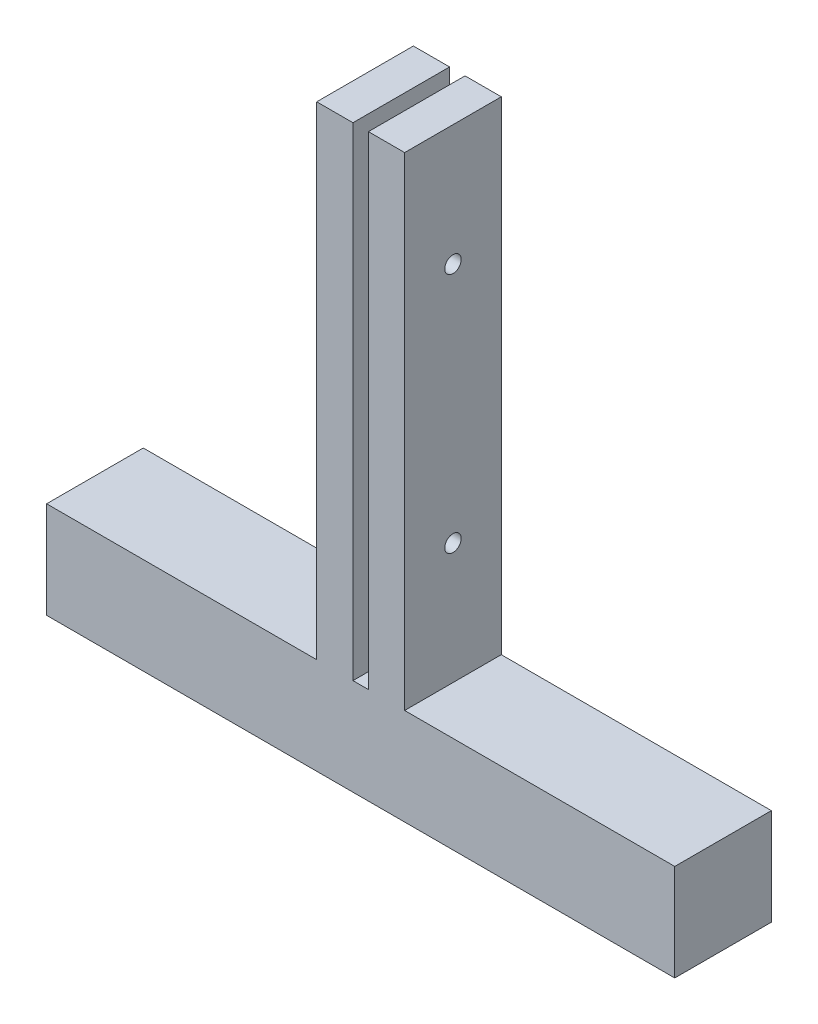
ISO-10303-21;
HEADER;
FILE_DESCRIPTION(('STEP AP214'),'2;1');
FILE_NAME('part.step','',(''),(''),'','','');
FILE_SCHEMA(('AUTOMOTIVE_DESIGN { 1 0 10303 214 1 1 1 1 }'));
ENDSEC;
DATA;
#1=APPLICATION_CONTEXT('core data for automotive mechanical design processes');
#2=APPLICATION_PROTOCOL_DEFINITION('international standard','automotive_design',2000,#1);
#3=PRODUCT_CONTEXT('',#1,'mechanical');
#4=PRODUCT('Part','Part','',(#3));
#5=PRODUCT_RELATED_PRODUCT_CATEGORY('part','',(#4));
#6=PRODUCT_DEFINITION_FORMATION('','',#4);
#7=PRODUCT_DEFINITION_CONTEXT('part definition',#1,'design');
#8=PRODUCT_DEFINITION('design','',#6,#7);
#9=PRODUCT_DEFINITION_SHAPE('','',#8);
#10=(LENGTH_UNIT() NAMED_UNIT(*) SI_UNIT(.MILLI.,.METRE.));
#11=(NAMED_UNIT(*) PLANE_ANGLE_UNIT() SI_UNIT($,.RADIAN.));
#12=(NAMED_UNIT(*) SI_UNIT($,.STERADIAN.) SOLID_ANGLE_UNIT());
#13=UNCERTAINTY_MEASURE_WITH_UNIT(LENGTH_MEASURE(1.E-05),#10,'distance_accuracy_value','');
#14=(GEOMETRIC_REPRESENTATION_CONTEXT(3) GLOBAL_UNCERTAINTY_ASSIGNED_CONTEXT((#13)) GLOBAL_UNIT_ASSIGNED_CONTEXT((#10,
#11,#12)) REPRESENTATION_CONTEXT('',''));
#15=CARTESIAN_POINT('',(0.,0.,0.));
#16=DIRECTION('',(0.,0.,1.));
#17=DIRECTION('',(1.,0.,0.));
#18=AXIS2_PLACEMENT_3D('',#15,#16,#17);
#19=CARTESIAN_POINT('',(0.,0.,20.));
#20=DIRECTION('',(0.,1.,0.));
#21=DIRECTION('',(0.,0.,1.));
#22=AXIS2_PLACEMENT_3D('',#19,#20,#21);
#23=PLANE('',#22);
#24=DIRECTION('',(1.,0.,0.));
#25=VECTOR('',#24,1.);
#26=CARTESIAN_POINT('',(0.,0.,0.));
#27=LINE('',#26,#25);
#28=CARTESIAN_POINT('',(-65.,0.,0.));
#29=VERTEX_POINT('',#28);
#30=CARTESIAN_POINT('',(65.,0.,0.));
#31=VERTEX_POINT('',#30);
#32=EDGE_CURVE('E112',#29,#31,#27,.T.);
#33=ORIENTED_EDGE('',*,*,#32,.T.);
#34=DIRECTION('',(0.,0.,-1.));
#35=VECTOR('',#34,1.);
#36=CARTESIAN_POINT('',(65.,0.,20.));
#37=LINE('',#36,#35);
#38=CARTESIAN_POINT('',(65.,0.,20.));
#39=VERTEX_POINT('',#38);
#40=EDGE_CURVE('E11',#39,#31,#37,.T.);
#41=ORIENTED_EDGE('',*,*,#40,.F.);
#42=DIRECTION('',(1.,0.,0.));
#43=VECTOR('',#42,1.);
#44=CARTESIAN_POINT('',(-65.,0.,20.));
#45=LINE('',#44,#43);
#46=CARTESIAN_POINT('',(-65.,0.,20.));
#47=VERTEX_POINT('',#46);
#48=EDGE_CURVE('E118',#47,#39,#45,.T.);
#49=ORIENTED_EDGE('',*,*,#48,.F.);
#50=DIRECTION('',(0.,0.,-1.));
#51=VECTOR('',#50,1.);
#52=CARTESIAN_POINT('',(-65.,0.,20.));
#53=LINE('',#52,#51);
#54=EDGE_CURVE('E168',#47,#29,#53,.T.);
#55=ORIENTED_EDGE('',*,*,#54,.T.);
#56=EDGE_LOOP('',(#33,#41,#49,#55));
#57=FACE_BOUND('',#56,.T.);
#58=ADVANCED_FACE('F45',(#57),#23,.F.);
#59=CARTESIAN_POINT('',(65.,0.,20.));
#60=DIRECTION('',(-1.,0.,0.));
#61=DIRECTION('',(0.,0.,1.));
#62=AXIS2_PLACEMENT_3D('',#59,#60,#61);
#63=PLANE('',#62);
#64=DIRECTION('',(0.,1.,0.));
#65=VECTOR('',#64,1.);
#66=CARTESIAN_POINT('',(65.,0.,0.));
#67=LINE('',#66,#65);
#68=CARTESIAN_POINT('',(65.,20.,0.));
#69=VERTEX_POINT('',#68);
#70=EDGE_CURVE('E174',#31,#69,#67,.T.);
#71=ORIENTED_EDGE('',*,*,#70,.T.);
#72=DIRECTION('',(0.,0.,-1.));
#73=VECTOR('',#72,1.);
#74=CARTESIAN_POINT('',(65.,20.,20.));
#75=LINE('',#74,#73);
#76=CARTESIAN_POINT('',(65.,20.,20.));
#77=VERTEX_POINT('',#76);
#78=EDGE_CURVE('E55',#77,#69,#75,.T.);
#79=ORIENTED_EDGE('',*,*,#78,.F.);
#80=DIRECTION('',(0.,1.,0.));
#81=VECTOR('',#80,1.);
#82=CARTESIAN_POINT('',(65.,0.,20.));
#83=LINE('',#82,#81);
#84=EDGE_CURVE('E272',#39,#77,#83,.T.);
#85=ORIENTED_EDGE('',*,*,#84,.F.);
#86=ORIENTED_EDGE('',*,*,#40,.T.);
#87=EDGE_LOOP('',(#71,#79,#85,#86));
#88=FACE_BOUND('',#87,.T.);
#89=ADVANCED_FACE('F316',(#88),#63,.F.);
#90=CARTESIAN_POINT('',(65.,20.,20.));
#91=DIRECTION('',(0.,-1.,0.));
#92=DIRECTION('',(1.,0.,0.));
#93=AXIS2_PLACEMENT_3D('',#90,#91,#92);
#94=PLANE('',#93);
#95=DIRECTION('',(-1.,0.,0.));
#96=VECTOR('',#95,1.);
#97=CARTESIAN_POINT('',(65.,20.,0.));
#98=LINE('',#97,#96);
#99=CARTESIAN_POINT('',(9.1,20.,0.));
#100=VERTEX_POINT('',#99);
#101=EDGE_CURVE('E178',#69,#100,#98,.T.);
#102=ORIENTED_EDGE('',*,*,#101,.T.);
#103=DIRECTION('',(0.,0.,-1.));
#104=VECTOR('',#103,1.);
#105=CARTESIAN_POINT('',(9.1,20.,20.));
#106=LINE('',#105,#104);
#107=CARTESIAN_POINT('',(9.1,20.,20.));
#108=VERTEX_POINT('',#107);
#109=EDGE_CURVE('E233',#108,#100,#106,.T.);
#110=ORIENTED_EDGE('',*,*,#109,.F.);
#111=DIRECTION('',(-1.,0.,0.));
#112=VECTOR('',#111,1.);
#113=CARTESIAN_POINT('',(65.,20.,20.));
#114=LINE('',#113,#112);
#115=EDGE_CURVE('E275',#77,#108,#114,.T.);
#116=ORIENTED_EDGE('',*,*,#115,.F.);
#117=ORIENTED_EDGE('',*,*,#78,.T.);
#118=EDGE_LOOP('',(#102,#110,#116,#117));
#119=FACE_BOUND('',#118,.T.);
#120=ADVANCED_FACE('F321',(#119),#94,.F.);
#121=CARTESIAN_POINT('',(9.1,20.,20.));
#122=DIRECTION('',(-1.,0.,0.));
#123=DIRECTION('',(0.,0.,1.));
#124=AXIS2_PLACEMENT_3D('',#121,#122,#123);
#125=PLANE('',#124);
#126=CARTESIAN_POINT('',(9.1,95.,10.));
#127=DIRECTION('',(-1.,0.,0.));
#128=DIRECTION('',(0.,0.,1.));
#129=AXIS2_PLACEMENT_3D('',#126,#127,#128);
#130=CIRCLE('',#129,1.7);
#131=CARTESIAN_POINT('',(9.1,95.,11.7));
#132=VERTEX_POINT('',#131);
#133=EDGE_CURVE('E175',#132,#132,#130,.F.);
#134=ORIENTED_EDGE('',*,*,#133,.F.);
#135=EDGE_LOOP('',(#134));
#136=FACE_BOUND('',#135,.T.);
#137=CARTESIAN_POINT('',(9.1,45.,9.99999999999999));
#138=DIRECTION('',(-1.,0.,0.));
#139=DIRECTION('',(0.,0.,1.));
#140=AXIS2_PLACEMENT_3D('',#137,#138,#139);
#141=CIRCLE('',#140,1.7);
#142=CARTESIAN_POINT('',(9.1,45.,11.7));
#143=VERTEX_POINT('',#142);
#144=EDGE_CURVE('E253',#143,#143,#141,.F.);
#145=ORIENTED_EDGE('',*,*,#144,.F.);
#146=EDGE_LOOP('',(#145));
#147=FACE_BOUND('',#146,.T.);
#148=DIRECTION('',(0.,1.,0.));
#149=VECTOR('',#148,1.);
#150=CARTESIAN_POINT('',(9.1,20.,0.));
#151=LINE('',#150,#149);
#152=CARTESIAN_POINT('',(9.1,120.,0.));
#153=VERTEX_POINT('',#152);
#154=EDGE_CURVE('E181',#100,#153,#151,.T.);
#155=ORIENTED_EDGE('',*,*,#154,.T.);
#156=DIRECTION('',(0.,0.,-1.));
#157=VECTOR('',#156,1.);
#158=CARTESIAN_POINT('',(9.1,120.,20.));
#159=LINE('',#158,#157);
#160=CARTESIAN_POINT('',(9.1,120.,20.));
#161=VERTEX_POINT('',#160);
#162=EDGE_CURVE('E229',#161,#153,#159,.T.);
#163=ORIENTED_EDGE('',*,*,#162,.F.);
#164=DIRECTION('',(0.,1.,0.));
#165=VECTOR('',#164,1.);
#166=CARTESIAN_POINT('',(9.1,20.,20.));
#167=LINE('',#166,#165);
#168=EDGE_CURVE('E278',#108,#161,#167,.T.);
#169=ORIENTED_EDGE('',*,*,#168,.F.);
#170=ORIENTED_EDGE('',*,*,#109,.T.);
#171=EDGE_LOOP('',(#155,#163,#169,#170));
#172=FACE_BOUND('',#171,.T.);
#173=ADVANCED_FACE('F334',(#136,#147,#172),#125,.F.);
#174=CARTESIAN_POINT('',(9.1,120.,20.));
#175=DIRECTION('',(0.,-1.,0.));
#176=DIRECTION('',(0.,0.,-1.));
#177=AXIS2_PLACEMENT_3D('',#174,#175,#176);
#178=PLANE('',#177);
#179=DIRECTION('',(-1.,0.,0.));
#180=VECTOR('',#179,1.);
#181=CARTESIAN_POINT('',(9.1,120.,0.));
#182=LINE('',#181,#180);
#183=CARTESIAN_POINT('',(1.6,120.,0.));
#184=VERTEX_POINT('',#183);
#185=EDGE_CURVE('E184',#153,#184,#182,.T.);
#186=ORIENTED_EDGE('',*,*,#185,.T.);
#187=DIRECTION('',(0.,0.,-1.));
#188=VECTOR('',#187,1.);
#189=CARTESIAN_POINT('',(1.6,120.,20.));
#190=LINE('',#189,#188);
#191=CARTESIAN_POINT('',(1.6,120.,20.));
#192=VERTEX_POINT('',#191);
#193=EDGE_CURVE('E225',#192,#184,#190,.T.);
#194=ORIENTED_EDGE('',*,*,#193,.F.);
#195=DIRECTION('',(-1.,0.,0.));
#196=VECTOR('',#195,1.);
#197=CARTESIAN_POINT('',(9.1,120.,20.));
#198=LINE('',#197,#196);
#199=EDGE_CURVE('E281',#161,#192,#198,.T.);
#200=ORIENTED_EDGE('',*,*,#199,.F.);
#201=ORIENTED_EDGE('',*,*,#162,.T.);
#202=EDGE_LOOP('',(#186,#194,#200,#201));
#203=FACE_BOUND('',#202,.T.);
#204=ADVANCED_FACE('F341',(#203),#178,.F.);
#205=CARTESIAN_POINT('',(1.6,120.,20.));
#206=DIRECTION('',(1.,0.,0.));
#207=DIRECTION('',(0.,0.,-1.));
#208=AXIS2_PLACEMENT_3D('',#205,#206,#207);
#209=PLANE('',#208);
#210=CARTESIAN_POINT('',(1.6,95.,10.));
#211=DIRECTION('',(1.,0.,0.));
#212=DIRECTION('',(0.,0.,-1.));
#213=AXIS2_PLACEMENT_3D('',#210,#211,#212);
#214=CIRCLE('',#213,1.7);
#215=CARTESIAN_POINT('',(1.6,95.,8.3));
#216=VERTEX_POINT('',#215);
#217=EDGE_CURVE('E263',#216,#216,#214,.F.);
#218=ORIENTED_EDGE('',*,*,#217,.F.);
#219=EDGE_LOOP('',(#218));
#220=FACE_BOUND('',#219,.T.);
#221=CARTESIAN_POINT('',(1.6,45.,9.99999999999999));
#222=DIRECTION('',(1.,0.,0.));
#223=DIRECTION('',(0.,0.,-1.));
#224=AXIS2_PLACEMENT_3D('',#221,#222,#223);
#225=CIRCLE('',#224,1.7);
#226=CARTESIAN_POINT('',(1.6,45.,8.29999999999999));
#227=VERTEX_POINT('',#226);
#228=EDGE_CURVE('E247',#227,#227,#225,.F.);
#229=ORIENTED_EDGE('',*,*,#228,.F.);
#230=EDGE_LOOP('',(#229));
#231=FACE_BOUND('',#230,.T.);
#232=DIRECTION('',(0.,-1.,0.));
#233=VECTOR('',#232,1.);
#234=CARTESIAN_POINT('',(1.6,120.,0.));
#235=LINE('',#234,#233);
#236=CARTESIAN_POINT('',(1.6,20.,0.));
#237=VERTEX_POINT('',#236);
#238=EDGE_CURVE('E187',#184,#237,#235,.T.);
#239=ORIENTED_EDGE('',*,*,#238,.T.);
#240=DIRECTION('',(0.,0.,-1.));
#241=VECTOR('',#240,1.);
#242=CARTESIAN_POINT('',(1.6,20.,20.));
#243=LINE('',#242,#241);
#244=CARTESIAN_POINT('',(1.6,20.,20.));
#245=VERTEX_POINT('',#244);
#246=EDGE_CURVE('E221',#245,#237,#243,.T.);
#247=ORIENTED_EDGE('',*,*,#246,.F.);
#248=DIRECTION('',(0.,-1.,0.));
#249=VECTOR('',#248,1.);
#250=CARTESIAN_POINT('',(1.6,120.,20.));
#251=LINE('',#250,#249);
#252=EDGE_CURVE('E284',#192,#245,#251,.T.);
#253=ORIENTED_EDGE('',*,*,#252,.F.);
#254=ORIENTED_EDGE('',*,*,#193,.T.);
#255=EDGE_LOOP('',(#239,#247,#253,#254));
#256=FACE_BOUND('',#255,.T.);
#257=ADVANCED_FACE('F344',(#220,#231,#256),#209,.F.);
#258=CARTESIAN_POINT('',(1.6,20.,20.));
#259=DIRECTION('',(0.,-1.,0.));
#260=DIRECTION('',(0.,0.,-1.));
#261=AXIS2_PLACEMENT_3D('',#258,#259,#260);
#262=PLANE('',#261);
#263=DIRECTION('',(-1.,0.,0.));
#264=VECTOR('',#263,1.);
#265=CARTESIAN_POINT('',(1.6,20.,0.));
#266=LINE('',#265,#264);
#267=CARTESIAN_POINT('',(-1.59999999999998,20.,0.));
#268=VERTEX_POINT('',#267);
#269=EDGE_CURVE('E190',#237,#268,#266,.T.);
#270=ORIENTED_EDGE('',*,*,#269,.T.);
#271=DIRECTION('',(0.,0.,-1.));
#272=VECTOR('',#271,1.);
#273=CARTESIAN_POINT('',(-1.59999999999998,20.,20.));
#274=LINE('',#273,#272);
#275=CARTESIAN_POINT('',(-1.59999999999998,20.,20.));
#276=VERTEX_POINT('',#275);
#277=EDGE_CURVE('E217',#276,#268,#274,.T.);
#278=ORIENTED_EDGE('',*,*,#277,.F.);
#279=DIRECTION('',(-1.,0.,0.));
#280=VECTOR('',#279,1.);
#281=CARTESIAN_POINT('',(1.6,20.,20.));
#282=LINE('',#281,#280);
#283=EDGE_CURVE('E287',#245,#276,#282,.T.);
#284=ORIENTED_EDGE('',*,*,#283,.F.);
#285=ORIENTED_EDGE('',*,*,#246,.T.);
#286=EDGE_LOOP('',(#270,#278,#284,#285));
#287=FACE_BOUND('',#286,.T.);
#288=ADVANCED_FACE('F349',(#287),#262,.F.);
#289=CARTESIAN_POINT('',(-1.59999999999998,20.,20.));
#290=DIRECTION('',(-1.,0.,0.));
#291=DIRECTION('',(0.,0.,1.));
#292=AXIS2_PLACEMENT_3D('',#289,#290,#291);
#293=PLANE('',#292);
#294=CARTESIAN_POINT('',(-1.59999999999999,95.,10.));
#295=DIRECTION('',(-1.,0.,0.));
#296=DIRECTION('',(0.,0.,1.));
#297=AXIS2_PLACEMENT_3D('',#294,#295,#296);
#298=CIRCLE('',#297,1.7);
#299=CARTESIAN_POINT('',(-1.59999999999999,95.,11.7));
#300=VERTEX_POINT('',#299);
#301=EDGE_CURVE('E259',#300,#300,#298,.F.);
#302=ORIENTED_EDGE('',*,*,#301,.F.);
#303=EDGE_LOOP('',(#302));
#304=FACE_BOUND('',#303,.T.);
#305=CARTESIAN_POINT('',(-1.59999999999999,45.,9.99999999999999));
#306=DIRECTION('',(-1.,0.,0.));
#307=DIRECTION('',(0.,0.,1.));
#308=AXIS2_PLACEMENT_3D('',#305,#306,#307);
#309=CIRCLE('',#308,1.7);
#310=CARTESIAN_POINT('',(-1.59999999999999,45.,11.7));
#311=VERTEX_POINT('',#310);
#312=EDGE_CURVE('E242',#311,#311,#309,.F.);
#313=ORIENTED_EDGE('',*,*,#312,.F.);
#314=EDGE_LOOP('',(#313));
#315=FACE_BOUND('',#314,.T.);
#316=DIRECTION('',(0.,1.,0.));
#317=VECTOR('',#316,1.);
#318=CARTESIAN_POINT('',(-1.59999999999998,20.,0.));
#319=LINE('',#318,#317);
#320=CARTESIAN_POINT('',(-1.59999999999998,120.,0.));
#321=VERTEX_POINT('',#320);
#322=EDGE_CURVE('E193',#268,#321,#319,.T.);
#323=ORIENTED_EDGE('',*,*,#322,.T.);
#324=DIRECTION('',(0.,0.,-1.));
#325=VECTOR('',#324,1.);
#326=CARTESIAN_POINT('',(-1.59999999999998,120.,20.));
#327=LINE('',#326,#325);
#328=CARTESIAN_POINT('',(-1.59999999999998,120.,20.));
#329=VERTEX_POINT('',#328);
#330=EDGE_CURVE('E213',#329,#321,#327,.T.);
#331=ORIENTED_EDGE('',*,*,#330,.F.);
#332=DIRECTION('',(0.,1.,0.));
#333=VECTOR('',#332,1.);
#334=CARTESIAN_POINT('',(-1.59999999999998,20.,20.));
#335=LINE('',#334,#333);
#336=EDGE_CURVE('E290',#276,#329,#335,.T.);
#337=ORIENTED_EDGE('',*,*,#336,.F.);
#338=ORIENTED_EDGE('',*,*,#277,.T.);
#339=EDGE_LOOP('',(#323,#331,#337,#338));
#340=FACE_BOUND('',#339,.T.);
#341=ADVANCED_FACE('F312',(#304,#315,#340),#293,.F.);
#342=CARTESIAN_POINT('',(-1.59999999999998,120.,20.));
#343=DIRECTION('',(0.,-1.,0.));
#344=DIRECTION('',(0.,0.,-1.));
#345=AXIS2_PLACEMENT_3D('',#342,#343,#344);
#346=PLANE('',#345);
#347=DIRECTION('',(-1.,0.,0.));
#348=VECTOR('',#347,1.);
#349=CARTESIAN_POINT('',(-1.59999999999998,120.,0.));
#350=LINE('',#349,#348);
#351=CARTESIAN_POINT('',(-9.09999999999997,120.,0.));
#352=VERTEX_POINT('',#351);
#353=EDGE_CURVE('E196',#321,#352,#350,.T.);
#354=ORIENTED_EDGE('',*,*,#353,.T.);
#355=DIRECTION('',(0.,0.,-1.));
#356=VECTOR('',#355,1.);
#357=CARTESIAN_POINT('',(-9.09999999999997,120.,20.));
#358=LINE('',#357,#356);
#359=CARTESIAN_POINT('',(-9.09999999999997,120.,20.));
#360=VERTEX_POINT('',#359);
#361=EDGE_CURVE('E161',#360,#352,#358,.T.);
#362=ORIENTED_EDGE('',*,*,#361,.F.);
#363=DIRECTION('',(-1.,0.,0.));
#364=VECTOR('',#363,1.);
#365=CARTESIAN_POINT('',(-1.59999999999998,120.,20.));
#366=LINE('',#365,#364);
#367=EDGE_CURVE('E150',#329,#360,#366,.T.);
#368=ORIENTED_EDGE('',*,*,#367,.F.);
#369=ORIENTED_EDGE('',*,*,#330,.T.);
#370=EDGE_LOOP('',(#354,#362,#368,#369));
#371=FACE_BOUND('',#370,.T.);
#372=ADVANCED_FACE('F302',(#371),#346,.F.);
#373=CARTESIAN_POINT('',(-9.09999999999997,120.,20.));
#374=DIRECTION('',(1.,0.,0.));
#375=DIRECTION('',(0.,0.,-1.));
#376=AXIS2_PLACEMENT_3D('',#373,#374,#375);
#377=PLANE('',#376);
#378=CARTESIAN_POINT('',(-9.09999999999997,95.,10.));
#379=DIRECTION('',(1.,0.,0.));
#380=DIRECTION('',(0.,0.,-1.));
#381=AXIS2_PLACEMENT_3D('',#378,#379,#380);
#382=CIRCLE('',#381,1.7);
#383=CARTESIAN_POINT('',(-9.09999999999997,95.,8.3));
#384=VERTEX_POINT('',#383);
#385=EDGE_CURVE('E48',#384,#384,#382,.F.);
#386=ORIENTED_EDGE('',*,*,#385,.F.);
#387=EDGE_LOOP('',(#386));
#388=FACE_BOUND('',#387,.T.);
#389=CARTESIAN_POINT('',(-9.09999999999997,45.,9.99999999999999));
#390=DIRECTION('',(1.,0.,0.));
#391=DIRECTION('',(0.,0.,-1.));
#392=AXIS2_PLACEMENT_3D('',#389,#390,#391);
#393=CIRCLE('',#392,1.7);
#394=CARTESIAN_POINT('',(-9.09999999999997,45.,8.29999999999999));
#395=VERTEX_POINT('',#394);
#396=EDGE_CURVE('E239',#395,#395,#393,.F.);
#397=ORIENTED_EDGE('',*,*,#396,.F.);
#398=EDGE_LOOP('',(#397));
#399=FACE_BOUND('',#398,.T.);
#400=DIRECTION('',(0.,-1.,0.));
#401=VECTOR('',#400,1.);
#402=CARTESIAN_POINT('',(-9.09999999999997,120.,0.));
#403=LINE('',#402,#401);
#404=CARTESIAN_POINT('',(-9.09999999999997,20.,0.));
#405=VERTEX_POINT('',#404);
#406=EDGE_CURVE('E159',#352,#405,#403,.T.);
#407=ORIENTED_EDGE('',*,*,#406,.T.);
#408=DIRECTION('',(0.,0.,-1.));
#409=VECTOR('',#408,1.);
#410=CARTESIAN_POINT('',(-9.09999999999997,20.,20.));
#411=LINE('',#410,#409);
#412=CARTESIAN_POINT('',(-9.09999999999997,20.,20.));
#413=VERTEX_POINT('',#412);
#414=EDGE_CURVE('E156',#413,#405,#411,.T.);
#415=ORIENTED_EDGE('',*,*,#414,.F.);
#416=DIRECTION('',(0.,-1.,0.));
#417=VECTOR('',#416,1.);
#418=CARTESIAN_POINT('',(-9.09999999999997,120.,20.));
#419=LINE('',#418,#417);
#420=EDGE_CURVE('E144',#360,#413,#419,.T.);
#421=ORIENTED_EDGE('',*,*,#420,.F.);
#422=ORIENTED_EDGE('',*,*,#361,.T.);
#423=EDGE_LOOP('',(#407,#415,#421,#422));
#424=FACE_BOUND('',#423,.T.);
#425=ADVANCED_FACE('F157',(#388,#399,#424),#377,.F.);
#426=CARTESIAN_POINT('',(-9.09999999999997,20.,20.));
#427=DIRECTION('',(0.,-1.,0.));
#428=DIRECTION('',(1.,0.,0.));
#429=AXIS2_PLACEMENT_3D('',#426,#427,#428);
#430=PLANE('',#429);
#431=DIRECTION('',(-1.,0.,0.));
#432=VECTOR('',#431,1.);
#433=CARTESIAN_POINT('',(-9.09999999999997,20.,0.));
#434=LINE('',#433,#432);
#435=CARTESIAN_POINT('',(-65.,20.,0.));
#436=VERTEX_POINT('',#435);
#437=EDGE_CURVE('E105',#405,#436,#434,.T.);
#438=ORIENTED_EDGE('',*,*,#437,.T.);
#439=DIRECTION('',(0.,0.,-1.));
#440=VECTOR('',#439,1.);
#441=CARTESIAN_POINT('',(-65.,20.,20.));
#442=LINE('',#441,#440);
#443=CARTESIAN_POINT('',(-65.,20.,20.));
#444=VERTEX_POINT('',#443);
#445=EDGE_CURVE('E162',#444,#436,#442,.T.);
#446=ORIENTED_EDGE('',*,*,#445,.F.);
#447=DIRECTION('',(-1.,0.,0.));
#448=VECTOR('',#447,1.);
#449=CARTESIAN_POINT('',(-9.09999999999997,20.,20.));
#450=LINE('',#449,#448);
#451=EDGE_CURVE('E148',#413,#444,#450,.T.);
#452=ORIENTED_EDGE('',*,*,#451,.F.);
#453=ORIENTED_EDGE('',*,*,#414,.T.);
#454=EDGE_LOOP('',(#438,#446,#452,#453));
#455=FACE_BOUND('',#454,.T.);
#456=ADVANCED_FACE('F164',(#455),#430,.F.);
#457=CARTESIAN_POINT('',(-65.,20.,20.));
#458=DIRECTION('',(1.,0.,0.));
#459=DIRECTION('',(0.,0.,-1.));
#460=AXIS2_PLACEMENT_3D('',#457,#458,#459);
#461=PLANE('',#460);
#462=DIRECTION('',(0.,-1.,0.));
#463=VECTOR('',#462,1.);
#464=CARTESIAN_POINT('',(-65.,20.,0.));
#465=LINE('',#464,#463);
#466=EDGE_CURVE('E203',#436,#29,#465,.T.);
#467=ORIENTED_EDGE('',*,*,#466,.T.);
#468=ORIENTED_EDGE('',*,*,#54,.F.);
#469=DIRECTION('',(0.,-1.,0.));
#470=VECTOR('',#469,1.);
#471=CARTESIAN_POINT('',(-65.,20.,20.));
#472=LINE('',#471,#470);
#473=EDGE_CURVE('E64',#444,#47,#472,.T.);
#474=ORIENTED_EDGE('',*,*,#473,.F.);
#475=ORIENTED_EDGE('',*,*,#445,.T.);
#476=EDGE_LOOP('',(#467,#468,#474,#475));
#477=FACE_BOUND('',#476,.T.);
#478=ADVANCED_FACE('F309',(#477),#461,.F.);
#479=CARTESIAN_POINT('',(0.,0.,20.));
#480=DIRECTION('',(0.,0.,1.));
#481=DIRECTION('',(1.,0.,0.));
#482=AXIS2_PLACEMENT_3D('',#479,#480,#481);
#483=PLANE('',#482);
#484=ORIENTED_EDGE('',*,*,#48,.T.);
#485=ORIENTED_EDGE('',*,*,#84,.T.);
#486=ORIENTED_EDGE('',*,*,#115,.T.);
#487=ORIENTED_EDGE('',*,*,#168,.T.);
#488=ORIENTED_EDGE('',*,*,#199,.T.);
#489=ORIENTED_EDGE('',*,*,#252,.T.);
#490=ORIENTED_EDGE('',*,*,#283,.T.);
#491=ORIENTED_EDGE('',*,*,#336,.T.);
#492=ORIENTED_EDGE('',*,*,#367,.T.);
#493=ORIENTED_EDGE('',*,*,#420,.T.);
#494=ORIENTED_EDGE('',*,*,#451,.T.);
#495=ORIENTED_EDGE('',*,*,#473,.T.);
#496=EDGE_LOOP('',(#484,#485,#486,#487,#488,#489,#490,#491,#492,#493,#494,#495));
#497=FACE_BOUND('',#496,.T.);
#498=ADVANCED_FACE('F146',(#497),#483,.T.);
#499=CARTESIAN_POINT('',(0.,0.,0.));
#500=DIRECTION('',(0.,0.,1.));
#501=DIRECTION('',(1.,0.,0.));
#502=AXIS2_PLACEMENT_3D('',#499,#500,#501);
#503=PLANE('',#502);
#504=ORIENTED_EDGE('',*,*,#32,.F.);
#505=ORIENTED_EDGE('',*,*,#466,.F.);
#506=ORIENTED_EDGE('',*,*,#437,.F.);
#507=ORIENTED_EDGE('',*,*,#406,.F.);
#508=ORIENTED_EDGE('',*,*,#353,.F.);
#509=ORIENTED_EDGE('',*,*,#322,.F.);
#510=ORIENTED_EDGE('',*,*,#269,.F.);
#511=ORIENTED_EDGE('',*,*,#238,.F.);
#512=ORIENTED_EDGE('',*,*,#185,.F.);
#513=ORIENTED_EDGE('',*,*,#154,.F.);
#514=ORIENTED_EDGE('',*,*,#101,.F.);
#515=ORIENTED_EDGE('',*,*,#70,.F.);
#516=EDGE_LOOP('',(#504,#505,#506,#507,#508,#509,#510,#511,#512,#513,#514,#515));
#517=FACE_BOUND('',#516,.T.);
#518=ADVANCED_FACE('F326',(#517),#503,.F.);
#519=CARTESIAN_POINT('',(97.1000000000001,45.,9.99999999999999));
#520=DIRECTION('',(-1.,0.,0.));
#521=DIRECTION('',(0.,0.,1.));
#522=AXIS2_PLACEMENT_3D('',#519,#520,#521);
#523=CYLINDRICAL_SURFACE('',#522,1.7);
#524=ORIENTED_EDGE('',*,*,#396,.T.);
#525=EDGE_LOOP('',(#524));
#526=FACE_BOUND('',#525,.T.);
#527=ORIENTED_EDGE('',*,*,#312,.T.);
#528=EDGE_LOOP('',(#527));
#529=FACE_BOUND('',#528,.T.);
#530=ADVANCED_FACE('F364',(#526,#529),#523,.F.);
#531=CARTESIAN_POINT('',(97.1000000000001,95.,10.));
#532=DIRECTION('',(-1.,0.,0.));
#533=DIRECTION('',(0.,0.,1.));
#534=AXIS2_PLACEMENT_3D('',#531,#532,#533);
#535=CYLINDRICAL_SURFACE('',#534,1.7);
#536=ORIENTED_EDGE('',*,*,#385,.T.);
#537=EDGE_LOOP('',(#536));
#538=FACE_BOUND('',#537,.T.);
#539=ORIENTED_EDGE('',*,*,#301,.T.);
#540=EDGE_LOOP('',(#539));
#541=FACE_BOUND('',#540,.T.);
#542=ADVANCED_FACE('F297',(#538,#541),#535,.F.);
#543=ORIENTED_EDGE('',*,*,#228,.T.);
#544=EDGE_LOOP('',(#543));
#545=FACE_BOUND('',#544,.T.);
#546=ORIENTED_EDGE('',*,*,#144,.T.);
#547=EDGE_LOOP('',(#546));
#548=FACE_BOUND('',#547,.T.);
#549=ADVANCED_FACE('F366',(#545,#548),#523,.F.);
#550=ORIENTED_EDGE('',*,*,#217,.T.);
#551=EDGE_LOOP('',(#550));
#552=FACE_BOUND('',#551,.T.);
#553=ORIENTED_EDGE('',*,*,#133,.T.);
#554=EDGE_LOOP('',(#553));
#555=FACE_BOUND('',#554,.T.);
#556=ADVANCED_FACE('F369',(#552,#555),#535,.F.);
#557=CLOSED_SHELL('',(#58,#89,#120,#173,#204,#257,#288,#341,#372,#425,#456,#478,#498,#518,#530,
#542,#549,#556));
#558=MANIFOLD_SOLID_BREP('B2',#557);
#559=ADVANCED_BREP_SHAPE_REPRESENTATION('',(#18,#558),#14);
#560=SHAPE_DEFINITION_REPRESENTATION(#9,#559);
ENDSEC;
END-ISO-10303-21;
